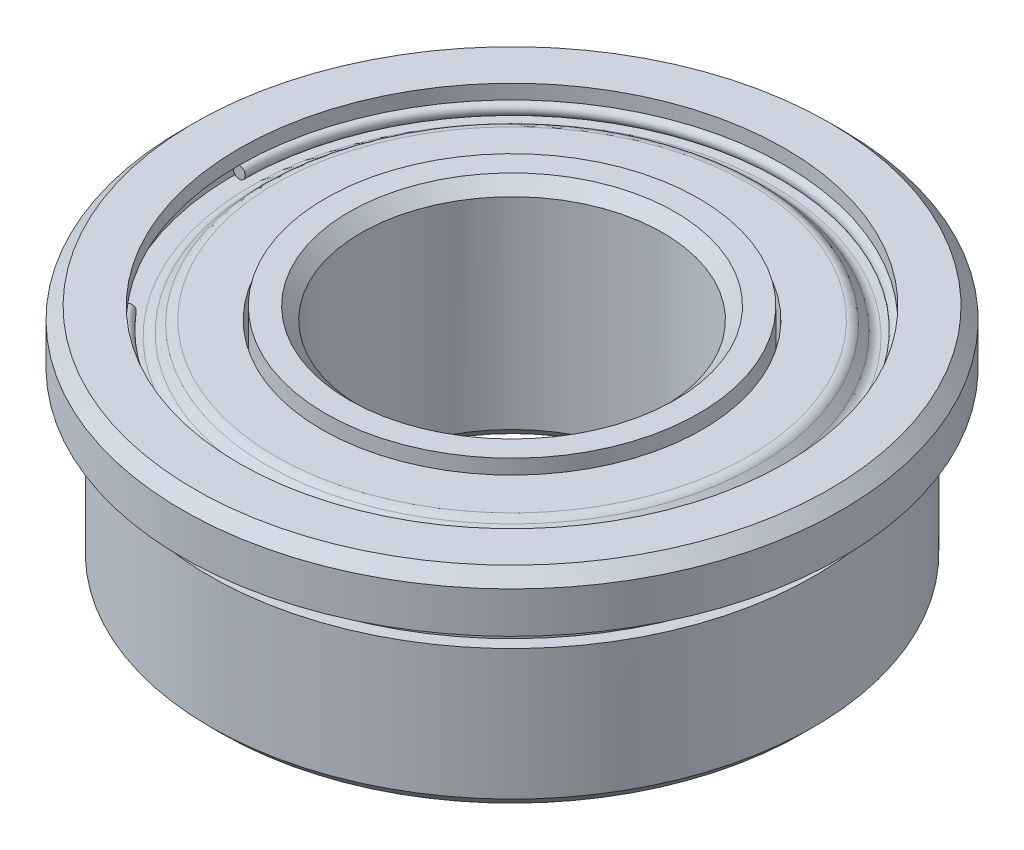
ISO-10303-21;
HEADER;
FILE_DESCRIPTION(('STEP AP214'),'2;1');
FILE_NAME('part.step','',(''),(''),'','','');
FILE_SCHEMA(('AUTOMOTIVE_DESIGN { 1 0 10303 214 1 1 1 1 }'));
ENDSEC;
DATA;
#1=APPLICATION_CONTEXT('core data for automotive mechanical design processes');
#2=APPLICATION_PROTOCOL_DEFINITION('international standard','automotive_design',2000,#1);
#3=PRODUCT_CONTEXT('',#1,'mechanical');
#4=PRODUCT('Part','Part','',(#3));
#5=PRODUCT_RELATED_PRODUCT_CATEGORY('part','',(#4));
#6=PRODUCT_DEFINITION_FORMATION('','',#4);
#7=PRODUCT_DEFINITION_CONTEXT('part definition',#1,'design');
#8=PRODUCT_DEFINITION('design','',#6,#7);
#9=PRODUCT_DEFINITION_SHAPE('','',#8);
#10=(LENGTH_UNIT() NAMED_UNIT(*) SI_UNIT(.MILLI.,.METRE.));
#11=(NAMED_UNIT(*) PLANE_ANGLE_UNIT() SI_UNIT($,.RADIAN.));
#12=(NAMED_UNIT(*) SI_UNIT($,.STERADIAN.) SOLID_ANGLE_UNIT());
#13=UNCERTAINTY_MEASURE_WITH_UNIT(LENGTH_MEASURE(1.E-05),#10,'distance_accuracy_value','');
#14=(GEOMETRIC_REPRESENTATION_CONTEXT(3) GLOBAL_UNCERTAINTY_ASSIGNED_CONTEXT((#13)) GLOBAL_UNIT_ASSIGNED_CONTEXT((#10,
#11,#12)) REPRESENTATION_CONTEXT('',''));
#15=CARTESIAN_POINT('',(0.,0.,0.));
#16=DIRECTION('',(0.,0.,1.));
#17=DIRECTION('',(1.,0.,0.));
#18=AXIS2_PLACEMENT_3D('',#15,#16,#17);
#19=CARTESIAN_POINT('',(-5.7404,0.431800000000002,0.));
#20=DIRECTION('',(0.,0.,1.));
#21=DIRECTION('',(1.,0.,0.));
#22=AXIS2_PLACEMENT_3D('',#19,#20,#21);
#23=PLANE('',#22);
#24=CARTESIAN_POINT('',(-5.6134,0.431800000000002,0.));
#25=CARTESIAN_POINT('',(-5.61340899992696,0.417569642926092,0.));
#26=CARTESIAN_POINT('',(-5.61583449231307,0.403251719708381,0.));
#27=CARTESIAN_POINT('',(-5.62528379429475,0.376272860189244,0.));
#28=CARTESIAN_POINT('',(-5.63230760389031,0.363611923887818,0.));
#29=CARTESIAN_POINT('',(-5.65015126434134,0.341316101747298,0.));
#30=CARTESIAN_POINT('',(-5.66097111519689,0.331681215908281,0.));
#31=CARTESIAN_POINT('',(-5.68518979269764,0.316539316925007,0.));
#32=CARTESIAN_POINT('',(-5.69858861934284,0.311032303780751,0.));
#33=CARTESIAN_POINT('',(-5.72645386450994,0.304763137356642,0.));
#34=CARTESIAN_POINT('',(-5.74092028303185,0.304000984076788,0.));
#35=CARTESIAN_POINT('',(-5.76929001376165,0.307307449590691,0.));
#36=CARTESIAN_POINT('',(-5.78319332596954,0.311376068384447,0.));
#37=CARTESIAN_POINT('',(-5.80886899590066,0.323889318093972,0.));
#38=CARTESIAN_POINT('',(-5.8206413536239,0.332333949009741,0.));
#39=CARTESIAN_POINT('',(-5.84072901054135,0.35263138586272,0.));
#40=CARTESIAN_POINT('',(-5.84904430973557,0.36448419179993,0.));
#41=CARTESIAN_POINT('',(-5.86127615792845,0.390320794880103,0.));
#42=CARTESIAN_POINT('',(-5.8651927069271,0.404304592023067,0.));
#43=CARTESIAN_POINT('',(-5.86716833023764,0.422889694465366,0.));
#44=CARTESIAN_POINT('',(-5.86740282036117,0.427340547537076,0.));
#45=CARTESIAN_POINT('',(-5.86739100007304,0.446030357073912,0.));
#46=CARTESIAN_POINT('',(-5.86496550768693,0.460348280291623,0.));
#47=CARTESIAN_POINT('',(-5.85551620570525,0.48732713981076,0.));
#48=CARTESIAN_POINT('',(-5.84849239610969,0.499988076112186,0.));
#49=CARTESIAN_POINT('',(-5.83064873565866,0.522283898252706,0.));
#50=CARTESIAN_POINT('',(-5.8198288848031,0.531918784091723,0.));
#51=CARTESIAN_POINT('',(-5.79561020730236,0.547060683074997,0.));
#52=CARTESIAN_POINT('',(-5.78221138065716,0.552567696219253,0.));
#53=CARTESIAN_POINT('',(-5.75434613549006,0.558836862643363,0.));
#54=CARTESIAN_POINT('',(-5.73987971696815,0.559599015923216,0.));
#55=CARTESIAN_POINT('',(-5.71150998623835,0.556292550409314,0.));
#56=CARTESIAN_POINT('',(-5.69760667403046,0.552223931615557,0.));
#57=CARTESIAN_POINT('',(-5.67193100409933,0.539710681906032,0.));
#58=CARTESIAN_POINT('',(-5.6601586463761,0.531266050990263,0.));
#59=CARTESIAN_POINT('',(-5.64007098945865,0.510968614137284,0.));
#60=CARTESIAN_POINT('',(-5.63175569026443,0.499115808200075,0.));
#61=CARTESIAN_POINT('',(-5.61952384207155,0.473279205119902,0.));
#62=CARTESIAN_POINT('',(-5.61560729307289,0.459295407976938,0.));
#63=CARTESIAN_POINT('',(-5.61363166976236,0.440710305534639,0.));
#64=CARTESIAN_POINT('',(-5.61339717963883,0.436259452462929,0.));
#65=CARTESIAN_POINT('',(-5.6134,0.431800000000002,0.));
#66=B_SPLINE_CURVE_WITH_KNOTS('',3,(#24,#25,#26,#27,#28,#29,#30,#31,#32,#33,#34,#35,#36,#37,#38,
#39,#40,#41,#42,#43,#44,#45,#46,#47,#48,#49,#50,#51,#52,#53,#54,#55,#56,#57,#58,#59,#60,#61,#62,
#63,#64,#65),.UNSPECIFIED.,.T.,.F.,(4,2,2,2,2,2,2,2,2,2,2,2,2,2,2,2,2,2,2,2,4),(0.,
0.0426429642402332,0.0852859284804665,0.127928892721776,0.170571856963085,0.213214821204395,
0.255857785445704,0.298500749687013,0.341143713928322,0.383786678169631,0.397149959984692,
0.439792924224925,0.482435888465158,0.525078852706467,0.567721816947776,0.610364781189087,
0.653007745430395,0.695650709671705,0.738293673913014,0.780936638154323,0.794299919969383),.UNSPECIFIED.);
#67=CARTESIAN_POINT('',(-5.6134,0.431800000000002,0.));
#68=VERTEX_POINT('',#67);
#69=EDGE_CURVE('P0_E21',#68,#68,#66,.T.);
#70=ORIENTED_EDGE('',*,*,#69,.F.);
#71=EDGE_LOOP('',(#70));
#72=FACE_BOUND('',#71,.T.);
#73=ADVANCED_FACE('P0_F17',(#72),#23,.T.);
#74=CARTESIAN_POINT('',(-4.39740152128023,0.431800000000002,3.68985799464456));
#75=DIRECTION('',(0.64278760968653,0.,0.766044443118986));
#76=DIRECTION('',(0.766044443118986,0.,-0.64278760968653));
#77=AXIS2_PLACEMENT_3D('',#74,#75,#76);
#78=PLANE('',#77);
#79=CARTESIAN_POINT('',(-4.49468916555634,0.431800000000002,3.77149202107475));
#80=CARTESIAN_POINT('',(-4.4946822712123,0.417569642926092,3.77148623603321));
#81=CARTESIAN_POINT('',(-4.49282423624809,0.403251719708381,3.76992715958003));
#82=CARTESIAN_POINT('',(-4.48558565097368,0.376272860189244,3.76385326534602));
#83=CARTESIAN_POINT('',(-4.48020510066347,0.363611923887818,3.75933844756519));
#84=CARTESIAN_POINT('',(-4.46653606373006,0.341316101747298,3.74786876371582));
#85=CARTESIAN_POINT('',(-4.45824757710678,0.331681215908281,3.74091389764721));
#86=CARTESIAN_POINT('',(-4.43969499378764,0.316539316925007,3.72534643182674));
#87=CARTESIAN_POINT('',(-4.42943089709178,0.311032303780751,3.71673383207487));
#88=CARTESIAN_POINT('',(-4.40808488087537,0.304763137356642,3.69882239774058));
#89=CARTESIAN_POINT('',(-4.39700296135483,0.304000984076788,3.68952356315815));
#90=CARTESIAN_POINT('',(-4.37527048677648,0.307307449590691,3.67128785175489));
#91=CARTESIAN_POINT('',(-4.36461993171868,0.311376068384447,3.66235097493406));
#92=CARTESIAN_POINT('',(-4.34495122744459,0.323889318093972,3.64584697243193));
#93=CARTESIAN_POINT('',(-4.33593307822829,0.332333949009741,3.63827984675064));
#94=CARTESIAN_POINT('',(-4.3205450402714,0.35263138586272,3.62536774977647));
#95=CARTESIAN_POINT('',(-4.3141751515308,0.36448419179993,3.62002277848359));
#96=CARTESIAN_POINT('',(-4.30480501219357,0.390320794880103,3.61216029802164));
#97=CARTESIAN_POINT('',(-4.30180476159694,0.404304592023067,3.60964278885257));
#98=CARTESIAN_POINT('',(-4.30029134633821,0.422889694465366,3.60837288266715));
#99=CARTESIAN_POINT('',(-4.30011171648212,0.427340547537076,3.60822215532116));
#100=CARTESIAN_POINT('',(-4.30012077134815,0.446030357073912,3.6082297532559));
#101=CARTESIAN_POINT('',(-4.30197880631236,0.460348280291623,3.60978882970909));
#102=CARTESIAN_POINT('',(-4.30921739158678,0.48732713981076,3.6158627239431));
#103=CARTESIAN_POINT('',(-4.31459794189698,0.499988076112186,3.62037754172392));
#104=CARTESIAN_POINT('',(-4.32826697883039,0.522283898252706,3.63184722557329));
#105=CARTESIAN_POINT('',(-4.33655546545367,0.531918784091724,3.6388020916419));
#106=CARTESIAN_POINT('',(-4.35510804877281,0.547060683074997,3.65436955746238));
#107=CARTESIAN_POINT('',(-4.36537214546867,0.552567696219253,3.66298215721424));
#108=CARTESIAN_POINT('',(-4.38671816168508,0.558836862643363,3.68089359154854));
#109=CARTESIAN_POINT('',(-4.39780008120563,0.559599015923216,3.69019242613096));
#110=CARTESIAN_POINT('',(-4.41953255578397,0.556292550409314,3.70842813753422));
#111=CARTESIAN_POINT('',(-4.43018311084177,0.552223931615558,3.71736501435505));
#112=CARTESIAN_POINT('',(-4.44985181511587,0.539710681906033,3.73386901685718));
#113=CARTESIAN_POINT('',(-4.45886996433216,0.531266050990263,3.74143614253848));
#114=CARTESIAN_POINT('',(-4.47425800228906,0.510968614137284,3.75434823951265));
#115=CARTESIAN_POINT('',(-4.48062789102966,0.499115808200075,3.75969321080553));
#116=CARTESIAN_POINT('',(-4.48999803036688,0.473279205119902,3.76755569126747));
#117=CARTESIAN_POINT('',(-4.49299828096351,0.459295407976938,3.77007320043654));
#118=CARTESIAN_POINT('',(-4.49451169622224,0.440710305534638,3.77134310662196));
#119=CARTESIAN_POINT('',(-4.49469132607834,0.436259452462929,3.77149383396796));
#120=CARTESIAN_POINT('',(-4.49468916555634,0.431800000000002,3.77149202107475));
#121=B_SPLINE_CURVE_WITH_KNOTS('',3,(#79,#80,#81,#82,#83,#84,#85,#86,#87,#88,#89,#90,#91,#92,
#93,#94,#95,#96,#97,#98,#99,#100,#101,#102,#103,#104,#105,#106,#107,#108,#109,#110,#111,#112,
#113,#114,#115,#116,#117,#118,#119,#120),.UNSPECIFIED.,.T.,.F.,(4,2,2,2,2,2,2,2,2,2,2,2,2,2,2,2,
2,2,2,2,4),(0.,0.0426429642402332,0.0852859284804667,0.127928892721776,0.170571856963085,
0.213214821204394,0.255857785445703,0.298500749687013,0.341143713928323,0.383786678169632,
0.397149959984692,0.439792924224925,0.482435888465158,0.525078852706467,0.567721816947777,
0.610364781189086,0.653007745430395,0.695650709671705,0.738293673913014,0.780936638154323,
0.794299919969383),.UNSPECIFIED.);
#122=CARTESIAN_POINT('',(-4.49468916555634,0.431800000000002,3.77149202107475));
#123=VERTEX_POINT('',#122);
#124=EDGE_CURVE('P0_E11',#123,#123,#121,.T.);
#125=ORIENTED_EDGE('',*,*,#124,.F.);
#126=EDGE_LOOP('',(#125));
#127=FACE_BOUND('',#126,.T.);
#128=ADVANCED_FACE('P0_F42',(#127),#78,.F.);
#129=CARTESIAN_POINT('',(0.,0.431800000000002,0.));
#130=DIRECTION('',(0.,-1.,0.));
#131=DIRECTION('',(0.,0.,1.));
#132=AXIS2_PLACEMENT_3D('',#129,#130,#131);
#133=TOROIDAL_SURFACE('',#132,5.7404,0.127000000000001);
#134=ORIENTED_EDGE('',*,*,#124,.T.);
#135=EDGE_LOOP('',(#134));
#136=FACE_BOUND('',#135,.T.);
#137=ORIENTED_EDGE('',*,*,#69,.T.);
#138=EDGE_LOOP('',(#137));
#139=FACE_BOUND('',#138,.T.);
#140=ADVANCED_FACE('P0_F44',(#136,#139),#133,.T.);
#141=CLOSED_SHELL('',(#73,#128,#140));
#142=MANIFOLD_SOLID_BREP('P0_B1',#141);
#143=CARTESIAN_POINT('',(-4.39740152128023,4.318,3.68985799464456));
#144=DIRECTION('',(0.64278760968653,0.,0.766044443118986));
#145=DIRECTION('',(0.766044443118986,0.,-0.64278760968653));
#146=AXIS2_PLACEMENT_3D('',#143,#144,#145);
#147=PLANE('',#146);
#148=CARTESIAN_POINT('',(-4.30011387700412,4.318,3.60822396821436));
#149=CARTESIAN_POINT('',(-4.30012077134816,4.33223035707391,3.60822975325589));
#150=CARTESIAN_POINT('',(-4.30197880631237,4.34654828029162,3.60978882970908));
#151=CARTESIAN_POINT('',(-4.30921739158678,4.37352713981076,3.6158627239431));
#152=CARTESIAN_POINT('',(-4.31459794189698,4.38618807611218,3.62037754172392));
#153=CARTESIAN_POINT('',(-4.32826697883039,4.4084838982527,3.6318472255733));
#154=CARTESIAN_POINT('',(-4.33655546545367,4.41811878409172,3.6388020916419));
#155=CARTESIAN_POINT('',(-4.35510804877281,4.43326068307499,3.65436955746237));
#156=CARTESIAN_POINT('',(-4.36537214546868,4.43876769621925,3.66298215721424));
#157=CARTESIAN_POINT('',(-4.38671816168508,4.44503686264336,3.68089359154854));
#158=CARTESIAN_POINT('',(-4.39780008120562,4.44579901592321,3.69019242613097));
#159=CARTESIAN_POINT('',(-4.41953255578397,4.44249255040931,3.70842813753422));
#160=CARTESIAN_POINT('',(-4.43018311084177,4.43842393161555,3.71736501435505));
#161=CARTESIAN_POINT('',(-4.44985181511587,4.42591068190603,3.73386901685718));
#162=CARTESIAN_POINT('',(-4.45886996433217,4.41746605099026,3.74143614253847));
#163=CARTESIAN_POINT('',(-4.47425800228906,4.39716861413728,3.75434823951265));
#164=CARTESIAN_POINT('',(-4.48062789102965,4.38531580820007,3.75969321080553));
#165=CARTESIAN_POINT('',(-4.48999803036688,4.3594792051199,3.76755569126748));
#166=CARTESIAN_POINT('',(-4.49299828096351,4.34549540797693,3.77007320043655));
#167=CARTESIAN_POINT('',(-4.49451169622224,4.32691030553463,3.77134310662196));
#168=CARTESIAN_POINT('',(-4.49469132607833,4.32245945246292,3.77149383396796));
#169=CARTESIAN_POINT('',(-4.4946822712123,4.30376964292609,3.77148623603321));
#170=CARTESIAN_POINT('',(-4.49282423624809,4.28945171970838,3.76992715958002));
#171=CARTESIAN_POINT('',(-4.48558565097368,4.26247286018924,3.76385326534601));
#172=CARTESIAN_POINT('',(-4.48020510066347,4.24981192388781,3.75933844756519));
#173=CARTESIAN_POINT('',(-4.46653606373006,4.22751610174729,3.74786876371582));
#174=CARTESIAN_POINT('',(-4.45824757710679,4.21788121590828,3.74091389764721));
#175=CARTESIAN_POINT('',(-4.43969499378765,4.202739316925,3.72534643182673));
#176=CARTESIAN_POINT('',(-4.42943089709178,4.19723230378075,3.71673383207487));
#177=CARTESIAN_POINT('',(-4.40808488087537,4.19096313735664,3.69882239774058));
#178=CARTESIAN_POINT('',(-4.39700296135482,4.19020098407678,3.68952356315816));
#179=CARTESIAN_POINT('',(-4.37527048677648,4.19350744959069,3.6712878517549));
#180=CARTESIAN_POINT('',(-4.36461993171868,4.19757606838444,3.66235097493406));
#181=CARTESIAN_POINT('',(-4.34495122744458,4.21008931809397,3.64584697243194));
#182=CARTESIAN_POINT('',(-4.33593307822829,4.21853394900974,3.63827984675064));
#183=CARTESIAN_POINT('',(-4.3205450402714,4.23883138586272,3.62536774977647));
#184=CARTESIAN_POINT('',(-4.3141751515308,4.25068419179993,3.62002277848358));
#185=CARTESIAN_POINT('',(-4.30480501219357,4.2765207948801,3.61216029802164));
#186=CARTESIAN_POINT('',(-4.30180476159693,4.29050459202306,3.60964278885258));
#187=CARTESIAN_POINT('',(-4.30029134633821,4.30908969446536,3.60837288266715));
#188=CARTESIAN_POINT('',(-4.30011171648212,4.31354054753707,3.60822215532115));
#189=CARTESIAN_POINT('',(-4.30011387700412,4.318,3.60822396821436));
#190=B_SPLINE_CURVE_WITH_KNOTS('',3,(#148,#149,#150,#151,#152,#153,#154,#155,#156,#157,#158,
#159,#160,#161,#162,#163,#164,#165,#166,#167,#168,#169,#170,#171,#172,#173,#174,#175,#176,#177,
#178,#179,#180,#181,#182,#183,#184,#185,#186,#187,#188,#189),.UNSPECIFIED.,.T.,.F.,(4,2,2,2,2,2,
2,2,2,2,2,2,2,2,2,2,2,2,2,2,4),(0.,0.0426429642402329,0.0852859284804657,0.127928892721776,
0.170571856963086,0.213214821204394,0.255857785445703,0.298500749687014,0.341143713928323,
0.383786678169631,0.397149959984691,0.439792924224924,0.482435888465157,0.525078852706467,
0.567721816947777,0.610364781189087,0.653007745430396,0.695650709671705,0.738293673913014,
0.780936638154323,0.794299919969383),.UNSPECIFIED.);
#191=CARTESIAN_POINT('',(-4.30011387700412,4.318,3.60822396821436));
#192=VERTEX_POINT('',#191);
#193=EDGE_CURVE('P1_E21',#192,#192,#190,.T.);
#194=ORIENTED_EDGE('',*,*,#193,.F.);
#195=EDGE_LOOP('',(#194));
#196=FACE_BOUND('',#195,.T.);
#197=ADVANCED_FACE('P1_F17',(#196),#147,.F.);
#198=CARTESIAN_POINT('',(-5.7404,4.318,0.));
#199=DIRECTION('',(0.,0.,1.));
#200=DIRECTION('',(1.,0.,0.));
#201=AXIS2_PLACEMENT_3D('',#198,#199,#200);
#202=PLANE('',#201);
#203=CARTESIAN_POINT('',(-5.8674,4.318,0.));
#204=CARTESIAN_POINT('',(-5.86739100007304,4.33223035707391,0.));
#205=CARTESIAN_POINT('',(-5.86496550768693,4.34654828029162,0.));
#206=CARTESIAN_POINT('',(-5.85551620570525,4.37352713981076,0.));
#207=CARTESIAN_POINT('',(-5.84849239610969,4.38618807611218,0.));
#208=CARTESIAN_POINT('',(-5.83064873565866,4.4084838982527,0.));
#209=CARTESIAN_POINT('',(-5.8198288848031,4.41811878409172,0.));
#210=CARTESIAN_POINT('',(-5.79561020730235,4.43326068307499,0.));
#211=CARTESIAN_POINT('',(-5.78221138065716,4.43876769621925,0.));
#212=CARTESIAN_POINT('',(-5.75434613549006,4.44503686264336,0.));
#213=CARTESIAN_POINT('',(-5.73987971696815,4.44579901592321,0.));
#214=CARTESIAN_POINT('',(-5.71150998623835,4.44249255040931,0.));
#215=CARTESIAN_POINT('',(-5.69760667403046,4.43842393161555,0.));
#216=CARTESIAN_POINT('',(-5.67193100409933,4.42591068190603,0.));
#217=CARTESIAN_POINT('',(-5.6601586463761,4.41746605099026,0.));
#218=CARTESIAN_POINT('',(-5.64007098945865,4.39716861413728,0.));
#219=CARTESIAN_POINT('',(-5.63175569026443,4.38531580820007,0.));
#220=CARTESIAN_POINT('',(-5.61952384207155,4.3594792051199,0.));
#221=CARTESIAN_POINT('',(-5.61560729307289,4.34549540797693,0.));
#222=CARTESIAN_POINT('',(-5.61363166976236,4.32691030553463,0.));
#223=CARTESIAN_POINT('',(-5.61339717963883,4.32245945246292,0.));
#224=CARTESIAN_POINT('',(-5.61340899992696,4.30376964292609,0.));
#225=CARTESIAN_POINT('',(-5.61583449231307,4.28945171970838,0.));
#226=CARTESIAN_POINT('',(-5.62528379429475,4.26247286018924,0.));
#227=CARTESIAN_POINT('',(-5.63230760389031,4.24981192388781,0.));
#228=CARTESIAN_POINT('',(-5.65015126434134,4.22751610174729,0.));
#229=CARTESIAN_POINT('',(-5.6609711151969,4.21788121590828,0.));
#230=CARTESIAN_POINT('',(-5.68518979269764,4.202739316925,0.));
#231=CARTESIAN_POINT('',(-5.69858861934284,4.19723230378075,0.));
#232=CARTESIAN_POINT('',(-5.72645386450994,4.19096313735664,0.));
#233=CARTESIAN_POINT('',(-5.74092028303185,4.19020098407678,0.));
#234=CARTESIAN_POINT('',(-5.76929001376165,4.19350744959069,0.));
#235=CARTESIAN_POINT('',(-5.78319332596954,4.19757606838444,0.));
#236=CARTESIAN_POINT('',(-5.80886899590066,4.21008931809397,0.));
#237=CARTESIAN_POINT('',(-5.8206413536239,4.21853394900974,0.));
#238=CARTESIAN_POINT('',(-5.84072901054135,4.23883138586272,0.));
#239=CARTESIAN_POINT('',(-5.84904430973557,4.25068419179993,0.));
#240=CARTESIAN_POINT('',(-5.86127615792845,4.2765207948801,0.));
#241=CARTESIAN_POINT('',(-5.8651927069271,4.29050459202306,0.));
#242=CARTESIAN_POINT('',(-5.86716833023764,4.30908969446536,0.));
#243=CARTESIAN_POINT('',(-5.86740282036117,4.31354054753707,0.));
#244=CARTESIAN_POINT('',(-5.8674,4.318,0.));
#245=B_SPLINE_CURVE_WITH_KNOTS('',3,(#203,#204,#205,#206,#207,#208,#209,#210,#211,#212,#213,
#214,#215,#216,#217,#218,#219,#220,#221,#222,#223,#224,#225,#226,#227,#228,#229,#230,#231,#232,
#233,#234,#235,#236,#237,#238,#239,#240,#241,#242,#243,#244),.UNSPECIFIED.,.T.,.F.,(4,2,2,2,2,2,
2,2,2,2,2,2,2,2,2,2,2,2,2,2,4),(0.,0.0426429642402329,0.0852859284804661,0.127928892721776,
0.170571856963085,0.213214821204394,0.255857785445704,0.298500749687014,0.341143713928322,
0.383786678169632,0.397149959984692,0.439792924224924,0.482435888465158,0.525078852706468,
0.567721816947777,0.610364781189085,0.653007745430395,0.695650709671705,0.738293673913015,
0.780936638154323,0.794299919969383),.UNSPECIFIED.);
#246=CARTESIAN_POINT('',(-5.8674,4.318,0.));
#247=VERTEX_POINT('',#246);
#248=EDGE_CURVE('P1_E11',#247,#247,#245,.T.);
#249=ORIENTED_EDGE('',*,*,#248,.F.);
#250=EDGE_LOOP('',(#249));
#251=FACE_BOUND('',#250,.T.);
#252=ADVANCED_FACE('P1_F44',(#251),#202,.T.);
#253=CARTESIAN_POINT('',(0.,4.318,0.));
#254=DIRECTION('',(0.,1.,0.));
#255=DIRECTION('',(0.,0.,1.));
#256=AXIS2_PLACEMENT_3D('',#253,#254,#255);
#257=TOROIDAL_SURFACE('',#256,5.7404,0.127000000000001);
#258=ORIENTED_EDGE('',*,*,#248,.T.);
#259=EDGE_LOOP('',(#258));
#260=FACE_BOUND('',#259,.T.);
#261=ORIENTED_EDGE('',*,*,#193,.T.);
#262=EDGE_LOOP('',(#261));
#263=FACE_BOUND('',#262,.T.);
#264=ADVANCED_FACE('P1_F42',(#260,#263),#257,.T.);
#265=CLOSED_SHELL('',(#197,#252,#264));
#266=MANIFOLD_SOLID_BREP('P1_B1',#265);
#267=CARTESIAN_POINT('',(0.,4.7498,0.));
#268=DIRECTION('',(0.,1.,0.));
#269=DIRECTION('',(0.,0.,1.));
#270=AXIS2_PLACEMENT_3D('',#267,#268,#269);
#271=PLANE('',#270);
#272=CARTESIAN_POINT('',(0.,4.7498,0.));
#273=DIRECTION('',(0.,1.,0.));
#274=DIRECTION('',(0.,0.,1.));
#275=AXIS2_PLACEMENT_3D('',#272,#273,#274);
#276=CIRCLE('',#275,3.9243);
#277=CARTESIAN_POINT('',(0.,4.7498,3.9243));
#278=VERTEX_POINT('',#277);
#279=EDGE_CURVE('P2_E311',#278,#278,#276,.F.);
#280=ORIENTED_EDGE('',*,*,#279,.F.);
#281=EDGE_LOOP('',(#280));
#282=FACE_BOUND('',#281,.T.);
#283=CARTESIAN_POINT('',(0.,4.74979999995639,0.));
#284=DIRECTION('',(0.,1.,0.));
#285=DIRECTION('',(0.,0.,1.));
#286=AXIS2_PLACEMENT_3D('',#283,#284,#285);
#287=CIRCLE('',#286,3.42899999998281);
#288=CARTESIAN_POINT('',(0.,4.74979999995639,3.42899999998281));
#289=VERTEX_POINT('',#288);
#290=EDGE_CURVE('P2_E309',#289,#289,#287,.F.);
#291=ORIENTED_EDGE('',*,*,#290,.T.);
#292=EDGE_LOOP('',(#291));
#293=FACE_BOUND('',#292,.T.);
#294=ADVANCED_FACE('P2_F19',(#282,#293),#271,.T.);
#295=CARTESIAN_POINT('',(0.,4.4958,0.));
#296=DIRECTION('',(0.,1.,0.));
#297=DIRECTION('',(0.,0.,1.));
#298=AXIS2_PLACEMENT_3D('',#295,#296,#297);
#299=CYLINDRICAL_SURFACE('',#298,3.9243);
#300=CARTESIAN_POINT('',(0.,3.2258,0.));
#301=DIRECTION('',(0.,1.,0.));
#302=DIRECTION('',(0.,0.,1.));
#303=AXIS2_PLACEMENT_3D('',#300,#301,#302);
#304=CIRCLE('',#303,3.9243);
#305=CARTESIAN_POINT('',(0.,3.2258,3.9243));
#306=VERTEX_POINT('',#305);
#307=EDGE_CURVE('P2_E306',#306,#306,#304,.F.);
#308=ORIENTED_EDGE('',*,*,#307,.F.);
#309=EDGE_LOOP('',(#308));
#310=FACE_BOUND('',#309,.T.);
#311=ORIENTED_EDGE('',*,*,#279,.T.);
#312=EDGE_LOOP('',(#311));
#313=FACE_BOUND('',#312,.T.);
#314=ADVANCED_FACE('P2_F133',(#310,#313),#299,.T.);
#315=CARTESIAN_POINT('',(0.,4.74979999984271,0.));
#316=DIRECTION('',(0.,1.,0.));
#317=DIRECTION('',(0.,0.,1.));
#318=AXIS2_PLACEMENT_3D('',#315,#316,#317);
#319=CONICAL_SURFACE('',#318,3.42899999986912,0.785398163397448);
#320=ORIENTED_EDGE('',*,*,#290,.F.);
#321=EDGE_LOOP('',(#320));
#322=FACE_BOUND('',#321,.T.);
#323=CARTESIAN_POINT('',(0.,4.4958,0.));
#324=DIRECTION('',(0.,1.,0.));
#325=DIRECTION('',(0.,0.,1.));
#326=AXIS2_PLACEMENT_3D('',#323,#324,#325);
#327=CIRCLE('',#326,3.175);
#328=CARTESIAN_POINT('',(0.,4.4958,3.175));
#329=VERTEX_POINT('',#328);
#330=EDGE_CURVE('P2_E303',#329,#329,#327,.F.);
#331=ORIENTED_EDGE('',*,*,#330,.T.);
#332=EDGE_LOOP('',(#331));
#333=FACE_BOUND('',#332,.T.);
#334=ADVANCED_FACE('P2_F130',(#322,#333),#319,.F.);
#335=CARTESIAN_POINT('',(0.,3.2258,0.));
#336=DIRECTION('',(0.,1.,0.));
#337=DIRECTION('',(0.,0.,1.));
#338=AXIS2_PLACEMENT_3D('',#335,#336,#337);
#339=PLANE('',#338);
#340=CARTESIAN_POINT('',(0.,3.2258,0.));
#341=DIRECTION('',(0.,1.,0.));
#342=DIRECTION('',(0.,0.,1.));
#343=AXIS2_PLACEMENT_3D('',#340,#341,#342);
#344=CIRCLE('',#343,4.0005);
#345=CARTESIAN_POINT('',(0.,3.2258,4.0005));
#346=VERTEX_POINT('',#345);
#347=EDGE_CURVE('P2_E298',#346,#346,#344,.T.);
#348=ORIENTED_EDGE('',*,*,#347,.T.);
#349=EDGE_LOOP('',(#348));
#350=FACE_BOUND('',#349,.T.);
#351=ORIENTED_EDGE('',*,*,#307,.T.);
#352=EDGE_LOOP('',(#351));
#353=FACE_BOUND('',#352,.T.);
#354=ADVANCED_FACE('P2_F126',(#350,#353),#339,.T.);
#355=CARTESIAN_POINT('',(0.,0.,0.));
#356=DIRECTION('',(0.,1.,0.));
#357=DIRECTION('',(0.,0.,1.));
#358=AXIS2_PLACEMENT_3D('',#355,#356,#357);
#359=CYLINDRICAL_SURFACE('',#358,3.175);
#360=ORIENTED_EDGE('',*,*,#330,.F.);
#361=EDGE_LOOP('',(#360));
#362=FACE_BOUND('',#361,.T.);
#363=CARTESIAN_POINT('',(0.,0.254000000040833,0.));
#364=DIRECTION('',(0.,-1.,0.));
#365=DIRECTION('',(0.,0.,-1.));
#366=AXIS2_PLACEMENT_3D('',#363,#364,#365);
#367=CIRCLE('',#366,3.17499999999882);
#368=CARTESIAN_POINT('',(0.,0.254000000040833,-3.17499999999882));
#369=VERTEX_POINT('',#368);
#370=EDGE_CURVE('P2_E80',#369,#369,#367,.T.);
#371=ORIENTED_EDGE('',*,*,#370,.T.);
#372=EDGE_LOOP('',(#371));
#373=FACE_BOUND('',#372,.T.);
#374=ADVANCED_FACE('P2_F122',(#362,#373),#359,.F.);
#375=CARTESIAN_POINT('',(0.,3.2258,0.));
#376=DIRECTION('',(0.,1.,0.));
#377=DIRECTION('',(0.,0.,1.));
#378=AXIS2_PLACEMENT_3D('',#375,#376,#377);
#379=CYLINDRICAL_SURFACE('',#378,4.0005);
#380=CARTESIAN_POINT('',(0.,4.4958,0.));
#381=DIRECTION('',(0.,1.,0.));
#382=DIRECTION('',(0.,0.,1.));
#383=AXIS2_PLACEMENT_3D('',#380,#381,#382);
#384=CIRCLE('',#383,4.0005);
#385=CARTESIAN_POINT('',(0.,4.4958,4.0005));
#386=VERTEX_POINT('',#385);
#387=EDGE_CURVE('P2_E304',#386,#386,#384,.F.);
#388=ORIENTED_EDGE('',*,*,#387,.F.);
#389=EDGE_LOOP('',(#388));
#390=FACE_BOUND('',#389,.T.);
#391=ORIENTED_EDGE('',*,*,#347,.F.);
#392=EDGE_LOOP('',(#391));
#393=FACE_BOUND('',#392,.T.);
#394=ADVANCED_FACE('P2_F118',(#390,#393),#379,.F.);
#395=CARTESIAN_POINT('',(0.,5.6843418860808E-11,0.));
#396=DIRECTION('',(0.,-1.,0.));
#397=DIRECTION('',(0.,0.,-1.));
#398=AXIS2_PLACEMENT_3D('',#395,#396,#397);
#399=CONICAL_SURFACE('',#398,3.42899999998281,0.785398163285552);
#400=CARTESIAN_POINT('',(0.,0.,0.));
#401=DIRECTION('',(0.,-1.,0.));
#402=DIRECTION('',(0.,0.,-1.));
#403=AXIS2_PLACEMENT_3D('',#400,#401,#402);
#404=CIRCLE('',#403,3.42900000003965);
#405=CARTESIAN_POINT('',(0.,0.,-3.42900000003965));
#406=VERTEX_POINT('',#405);
#407=EDGE_CURVE('P2_E66',#406,#406,#404,.T.);
#408=ORIENTED_EDGE('',*,*,#407,.T.);
#409=EDGE_LOOP('',(#408));
#410=FACE_BOUND('',#409,.T.);
#411=ORIENTED_EDGE('',*,*,#370,.F.);
#412=EDGE_LOOP('',(#411));
#413=FACE_BOUND('',#412,.T.);
#414=ADVANCED_FACE('P2_F113',(#410,#413),#399,.F.);
#415=CARTESIAN_POINT('',(0.,4.4958,0.));
#416=DIRECTION('',(0.,1.,0.));
#417=DIRECTION('',(0.,0.,1.));
#418=AXIS2_PLACEMENT_3D('',#415,#416,#417);
#419=PLANE('',#418);
#420=ORIENTED_EDGE('',*,*,#387,.T.);
#421=EDGE_LOOP('',(#420));
#422=FACE_BOUND('',#421,.T.);
#423=CARTESIAN_POINT('',(0.,4.4958,0.));
#424=DIRECTION('',(0.,-1.,0.));
#425=DIRECTION('',(0.,0.,-1.));
#426=AXIS2_PLACEMENT_3D('',#423,#424,#425);
#427=CIRCLE('',#426,4.97478975515723);
#428=CARTESIAN_POINT('',(0.,4.4958,-4.97478975515723));
#429=VERTEX_POINT('',#428);
#430=CARTESIAN_POINT('',(0.,4.4958,4.97478975515723));
#431=VERTEX_POINT('',#430);
#432=EDGE_CURVE('P2_E64',#429,#431,#427,.T.);
#433=ORIENTED_EDGE('',*,*,#432,.F.);
#434=CARTESIAN_POINT('',(0.,4.4958,0.));
#435=DIRECTION('',(0.,-1.,0.));
#436=DIRECTION('',(0.,0.,1.));
#437=AXIS2_PLACEMENT_3D('',#434,#435,#436);
#438=CIRCLE('',#437,4.97478975515723);
#439=EDGE_CURVE('P2_E59',#431,#429,#438,.T.);
#440=ORIENTED_EDGE('',*,*,#439,.F.);
#441=EDGE_LOOP('',(#433,#440));
#442=FACE_BOUND('',#441,.T.);
#443=ADVANCED_FACE('P2_F63',(#422,#442),#419,.T.);
#444=CARTESIAN_POINT('',(0.,0.,0.));
#445=DIRECTION('',(0.,1.,0.));
#446=DIRECTION('',(0.,0.,1.));
#447=AXIS2_PLACEMENT_3D('',#444,#445,#446);
#448=PLANE('',#447);
#449=CARTESIAN_POINT('',(0.,0.,0.));
#450=DIRECTION('',(0.,-1.,0.));
#451=DIRECTION('',(0.,0.,-1.));
#452=AXIS2_PLACEMENT_3D('',#449,#450,#451);
#453=CIRCLE('',#452,3.9243);
#454=CARTESIAN_POINT('',(0.,0.,-3.9243));
#455=VERTEX_POINT('',#454);
#456=EDGE_CURVE('P2_E72',#455,#455,#453,.F.);
#457=ORIENTED_EDGE('',*,*,#456,.F.);
#458=EDGE_LOOP('',(#457));
#459=FACE_BOUND('',#458,.T.);
#460=ORIENTED_EDGE('',*,*,#407,.F.);
#461=EDGE_LOOP('',(#460));
#462=FACE_BOUND('',#461,.T.);
#463=ADVANCED_FACE('P2_F95',(#459,#462),#448,.F.);
#464=CARTESIAN_POINT('',(0.,4.2418,0.));
#465=DIRECTION('',(0.,1.,0.));
#466=DIRECTION('',(0.,0.,1.));
#467=AXIS2_PLACEMENT_3D('',#464,#465,#466);
#468=TOROIDAL_SURFACE('',#467,4.97478975515723,0.254);
#469=ORIENTED_EDGE('',*,*,#439,.T.);
#470=ORIENTED_EDGE('',*,*,#432,.T.);
#471=EDGE_LOOP('',(#469,#470));
#472=FACE_BOUND('',#471,.T.);
#473=CARTESIAN_POINT('',(0.,4.42140512245714,0.));
#474=DIRECTION('',(0.,-1.,0.));
#475=DIRECTION('',(0.,0.,-1.));
#476=AXIS2_PLACEMENT_3D('',#473,#474,#475);
#477=CIRCLE('',#476,5.15439487753611);
#478=CARTESIAN_POINT('',(0.,4.42140512245714,-5.15439487753611));
#479=VERTEX_POINT('',#478);
#480=EDGE_CURVE('P2_E100',#479,#479,#477,.T.);
#481=ORIENTED_EDGE('',*,*,#480,.F.);
#482=EDGE_LOOP('',(#481));
#483=FACE_BOUND('',#482,.T.);
#484=ADVANCED_FACE('P2_F70',(#472,#483),#468,.T.);
#485=CARTESIAN_POINT('',(0.,0.254,0.));
#486=DIRECTION('',(0.,-1.,0.));
#487=DIRECTION('',(0.,0.,-1.));
#488=AXIS2_PLACEMENT_3D('',#485,#486,#487);
#489=CYLINDRICAL_SURFACE('',#488,3.9243);
#490=ORIENTED_EDGE('',*,*,#456,.T.);
#491=EDGE_LOOP('',(#490));
#492=FACE_BOUND('',#491,.T.);
#493=CARTESIAN_POINT('',(0.,1.524,0.));
#494=DIRECTION('',(0.,-1.,0.));
#495=DIRECTION('',(0.,0.,-1.));
#496=AXIS2_PLACEMENT_3D('',#493,#494,#495);
#497=CIRCLE('',#496,3.9243);
#498=CARTESIAN_POINT('',(0.,1.524,-3.9243));
#499=VERTEX_POINT('',#498);
#500=EDGE_CURVE('P2_E363',#499,#499,#497,.F.);
#501=ORIENTED_EDGE('',*,*,#500,.F.);
#502=EDGE_LOOP('',(#501));
#503=FACE_BOUND('',#502,.T.);
#504=ADVANCED_FACE('P2_F94',(#492,#503),#489,.T.);
#505=CARTESIAN_POINT('',(0.,4.26539487756372,0.));
#506=DIRECTION('',(0.,-1.,0.));
#507=DIRECTION('',(0.,0.,-1.));
#508=AXIS2_PLACEMENT_3D('',#505,#506,#507);
#509=CONICAL_SURFACE('',#508,5.31040512237269,0.78539816321527);
#510=CARTESIAN_POINT('',(0.,4.26539487757862,0.));
#511=DIRECTION('',(0.,-1.,0.));
#512=DIRECTION('',(0.,0.,-1.));
#513=AXIS2_PLACEMENT_3D('',#510,#511,#512);
#514=CIRCLE('',#513,5.31040512242138);
#515=CARTESIAN_POINT('',(0.,4.26539487757862,-5.31040512242138));
#516=VERTEX_POINT('',#515);
#517=EDGE_CURVE('P2_E366',#516,#516,#514,.F.);
#518=ORIENTED_EDGE('',*,*,#517,.T.);
#519=EDGE_LOOP('',(#518));
#520=FACE_BOUND('',#519,.T.);
#521=ORIENTED_EDGE('',*,*,#480,.T.);
#522=EDGE_LOOP('',(#521));
#523=FACE_BOUND('',#522,.T.);
#524=ADVANCED_FACE('P2_F523',(#520,#523),#509,.T.);
#525=CARTESIAN_POINT('',(0.,1.524,0.));
#526=DIRECTION('',(0.,-1.,0.));
#527=DIRECTION('',(0.,0.,-1.));
#528=AXIS2_PLACEMENT_3D('',#525,#526,#527);
#529=PLANE('',#528);
#530=ORIENTED_EDGE('',*,*,#500,.T.);
#531=EDGE_LOOP('',(#530));
#532=FACE_BOUND('',#531,.T.);
#533=CARTESIAN_POINT('',(0.,1.524,0.));
#534=DIRECTION('',(0.,-1.,0.));
#535=DIRECTION('',(0.,0.,-1.));
#536=AXIS2_PLACEMENT_3D('',#533,#534,#535);
#537=CIRCLE('',#536,4.0005);
#538=CARTESIAN_POINT('',(0.,1.524,-4.0005));
#539=VERTEX_POINT('',#538);
#540=EDGE_CURVE('P2_E367',#539,#539,#537,.T.);
#541=ORIENTED_EDGE('',*,*,#540,.T.);
#542=EDGE_LOOP('',(#541));
#543=FACE_BOUND('',#542,.T.);
#544=ADVANCED_FACE('P2_F442',(#532,#543),#529,.T.);
#545=CARTESIAN_POINT('',(0.,4.445,0.));
#546=DIRECTION('',(0.,-1.,0.));
#547=DIRECTION('',(0.,0.,-1.));
#548=AXIS2_PLACEMENT_3D('',#545,#546,#547);
#549=TOROIDAL_SURFACE('',#548,5.49001024484277,0.254);
#550=CARTESIAN_POINT('',(0.,4.191,0.));
#551=DIRECTION('',(0.,1.,0.));
#552=DIRECTION('',(0.,0.,1.));
#553=AXIS2_PLACEMENT_3D('',#550,#551,#552);
#554=CIRCLE('',#553,5.49001024484277);
#555=CARTESIAN_POINT('',(0.,4.191,5.49001024484277));
#556=VERTEX_POINT('',#555);
#557=CARTESIAN_POINT('',(0.,4.191,-5.49001024484277));
#558=VERTEX_POINT('',#557);
#559=EDGE_CURVE('P2_E511',#556,#558,#554,.T.);
#560=ORIENTED_EDGE('',*,*,#559,.T.);
#561=CARTESIAN_POINT('',(0.,4.191,0.));
#562=DIRECTION('',(0.,1.,0.));
#563=DIRECTION('',(0.,0.,-1.));
#564=AXIS2_PLACEMENT_3D('',#561,#562,#563);
#565=CIRCLE('',#564,5.49001024484277);
#566=EDGE_CURVE('P2_E371',#558,#556,#565,.T.);
#567=ORIENTED_EDGE('',*,*,#566,.T.);
#568=EDGE_LOOP('',(#560,#567));
#569=FACE_BOUND('',#568,.T.);
#570=ORIENTED_EDGE('',*,*,#517,.F.);
#571=EDGE_LOOP('',(#570));
#572=FACE_BOUND('',#571,.T.);
#573=ADVANCED_FACE('P2_F431',(#569,#572),#549,.F.);
#574=CARTESIAN_POINT('',(0.,1.524,0.));
#575=DIRECTION('',(0.,-1.,0.));
#576=DIRECTION('',(0.,0.,-1.));
#577=AXIS2_PLACEMENT_3D('',#574,#575,#576);
#578=CYLINDRICAL_SURFACE('',#577,4.0005);
#579=ORIENTED_EDGE('',*,*,#540,.F.);
#580=EDGE_LOOP('',(#579));
#581=FACE_BOUND('',#580,.T.);
#582=CARTESIAN_POINT('',(0.,0.254,0.));
#583=DIRECTION('',(0.,-1.,0.));
#584=DIRECTION('',(0.,0.,-1.));
#585=AXIS2_PLACEMENT_3D('',#582,#583,#584);
#586=CIRCLE('',#585,4.0005);
#587=CARTESIAN_POINT('',(0.,0.254,-4.0005));
#588=VERTEX_POINT('',#587);
#589=EDGE_CURVE('P2_E372',#588,#588,#586,.F.);
#590=ORIENTED_EDGE('',*,*,#589,.F.);
#591=EDGE_LOOP('',(#590));
#592=FACE_BOUND('',#591,.T.);
#593=ADVANCED_FACE('P2_F441',(#581,#592),#578,.F.);
#594=CARTESIAN_POINT('',(0.,4.191,5.7404));
#595=DIRECTION('',(0.,-1.,0.));
#596=DIRECTION('',(0.,0.,-1.));
#597=AXIS2_PLACEMENT_3D('',#594,#595,#596);
#598=PLANE('',#597);
#599=CARTESIAN_POINT('',(0.,4.191,0.));
#600=DIRECTION('',(0.,1.,0.));
#601=DIRECTION('',(0.,0.,1.));
#602=AXIS2_PLACEMENT_3D('',#599,#600,#601);
#603=CIRCLE('',#602,5.8674);
#604=CARTESIAN_POINT('',(0.,4.191,5.8674));
#605=VERTEX_POINT('',#604);
#606=EDGE_CURVE('P2_E378',#605,#605,#603,.T.);
#607=ORIENTED_EDGE('',*,*,#606,.T.);
#608=EDGE_LOOP('',(#607));
#609=FACE_BOUND('',#608,.T.);
#610=ORIENTED_EDGE('',*,*,#566,.F.);
#611=ORIENTED_EDGE('',*,*,#559,.F.);
#612=EDGE_LOOP('',(#610,#611));
#613=FACE_BOUND('',#612,.T.);
#614=ADVANCED_FACE('P2_F452',(#609,#613),#598,.F.);
#615=CARTESIAN_POINT('',(0.,0.254,0.));
#616=DIRECTION('',(0.,-1.,0.));
#617=DIRECTION('',(0.,0.,-1.));
#618=AXIS2_PLACEMENT_3D('',#615,#616,#617);
#619=PLANE('',#618);
#620=ORIENTED_EDGE('',*,*,#589,.T.);
#621=EDGE_LOOP('',(#620));
#622=FACE_BOUND('',#621,.T.);
#623=CARTESIAN_POINT('',(0.,0.254,0.));
#624=DIRECTION('',(0.,1.,0.));
#625=DIRECTION('',(0.,0.,1.));
#626=AXIS2_PLACEMENT_3D('',#623,#624,#625);
#627=CIRCLE('',#626,4.97478975515723);
#628=CARTESIAN_POINT('',(0.,0.254,4.97478975515723));
#629=VERTEX_POINT('',#628);
#630=CARTESIAN_POINT('',(0.,0.254,-4.97478975515723));
#631=VERTEX_POINT('',#630);
#632=EDGE_CURVE('P2_E385',#629,#631,#627,.T.);
#633=ORIENTED_EDGE('',*,*,#632,.F.);
#634=CARTESIAN_POINT('',(0.,0.254,0.));
#635=DIRECTION('',(0.,1.,0.));
#636=DIRECTION('',(0.,0.,-1.));
#637=AXIS2_PLACEMENT_3D('',#634,#635,#636);
#638=CIRCLE('',#637,4.97478975515723);
#639=EDGE_CURVE('P2_E382',#631,#629,#638,.T.);
#640=ORIENTED_EDGE('',*,*,#639,.F.);
#641=EDGE_LOOP('',(#633,#640));
#642=FACE_BOUND('',#641,.T.);
#643=ADVANCED_FACE('P2_F460',(#622,#642),#619,.T.);
#644=CARTESIAN_POINT('',(0.,0.,0.));
#645=DIRECTION('',(0.,1.,0.));
#646=DIRECTION('',(0.,0.,1.));
#647=AXIS2_PLACEMENT_3D('',#644,#645,#646);
#648=CYLINDRICAL_SURFACE('',#647,5.8674);
#649=ORIENTED_EDGE('',*,*,#606,.F.);
#650=EDGE_LOOP('',(#649));
#651=FACE_BOUND('',#650,.T.);
#652=CARTESIAN_POINT('',(0.,4.445,0.));
#653=DIRECTION('',(0.,1.,0.));
#654=DIRECTION('',(0.,0.,1.));
#655=AXIS2_PLACEMENT_3D('',#652,#653,#654);
#656=CIRCLE('',#655,5.8674);
#657=CARTESIAN_POINT('',(0.,4.445,5.8674));
#658=VERTEX_POINT('',#657);
#659=EDGE_CURVE('P2_E290',#658,#658,#656,.T.);
#660=ORIENTED_EDGE('',*,*,#659,.T.);
#661=EDGE_LOOP('',(#660));
#662=FACE_BOUND('',#661,.T.);
#663=ADVANCED_FACE('P2_F410',(#651,#662),#648,.F.);
#664=CARTESIAN_POINT('',(0.,0.508,0.));
#665=DIRECTION('',(0.,-1.,0.));
#666=DIRECTION('',(0.,0.,-1.));
#667=AXIS2_PLACEMENT_3D('',#664,#665,#666);
#668=TOROIDAL_SURFACE('',#667,4.97478975515723,0.254);
#669=ORIENTED_EDGE('',*,*,#639,.T.);
#670=ORIENTED_EDGE('',*,*,#632,.T.);
#671=EDGE_LOOP('',(#669,#670));
#672=FACE_BOUND('',#671,.T.);
#673=CARTESIAN_POINT('',(0.,0.328394877556093,0.));
#674=DIRECTION('',(0.,1.,0.));
#675=DIRECTION('',(0.,0.,-1.));
#676=AXIS2_PLACEMENT_3D('',#673,#674,#675);
#677=CIRCLE('',#676,5.15439487753611);
#678=CARTESIAN_POINT('',(0.,0.328394877556093,-5.15439487753611));
#679=VERTEX_POINT('',#678);
#680=EDGE_CURVE('P2_E285',#679,#679,#677,.T.);
#681=ORIENTED_EDGE('',*,*,#680,.F.);
#682=EDGE_LOOP('',(#681));
#683=FACE_BOUND('',#682,.T.);
#684=ADVANCED_FACE('P2_F399',(#672,#683),#668,.T.);
#685=CARTESIAN_POINT('',(-5.7404,4.445,0.));
#686=DIRECTION('',(0.,1.,0.));
#687=DIRECTION('',(0.,0.,1.));
#688=AXIS2_PLACEMENT_3D('',#685,#686,#687);
#689=PLANE('',#688);
#690=CARTESIAN_POINT('',(0.,4.445,0.));
#691=DIRECTION('',(0.,1.,0.));
#692=DIRECTION('',(0.,0.,1.));
#693=AXIS2_PLACEMENT_3D('',#690,#691,#692);
#694=CIRCLE('',#693,5.7404);
#695=CARTESIAN_POINT('',(0.,4.445,5.7404));
#696=VERTEX_POINT('',#695);
#697=EDGE_CURVE('P2_E281',#696,#696,#694,.T.);
#698=ORIENTED_EDGE('',*,*,#697,.T.);
#699=EDGE_LOOP('',(#698));
#700=FACE_BOUND('',#699,.T.);
#701=ORIENTED_EDGE('',*,*,#659,.F.);
#702=EDGE_LOOP('',(#701));
#703=FACE_BOUND('',#702,.T.);
#704=ADVANCED_FACE('P2_F409',(#700,#703),#689,.F.);
#705=CARTESIAN_POINT('',(0.,0.484405122392673,0.));
#706=DIRECTION('',(0.,1.,0.));
#707=DIRECTION('',(0.,0.,1.));
#708=AXIS2_PLACEMENT_3D('',#705,#706,#707);
#709=CONICAL_SURFACE('',#708,5.31040512237269,0.785398163397448);
#710=ORIENTED_EDGE('',*,*,#680,.T.);
#711=EDGE_LOOP('',(#710));
#712=FACE_BOUND('',#711,.T.);
#713=CARTESIAN_POINT('',(0.,0.484405122421384,0.));
#714=DIRECTION('',(0.,1.,0.));
#715=DIRECTION('',(0.,0.,1.));
#716=AXIS2_PLACEMENT_3D('',#713,#714,#715);
#717=CIRCLE('',#716,5.31040512242138);
#718=CARTESIAN_POINT('',(0.,0.484405122421384,5.31040512242138));
#719=VERTEX_POINT('',#718);
#720=EDGE_CURVE('P2_E277',#719,#719,#717,.F.);
#721=ORIENTED_EDGE('',*,*,#720,.T.);
#722=EDGE_LOOP('',(#721));
#723=FACE_BOUND('',#722,.T.);
#724=ADVANCED_FACE('P2_F490',(#712,#723),#709,.T.);
#725=CARTESIAN_POINT('',(0.,4.4958,0.));
#726=DIRECTION('',(0.,1.,0.));
#727=DIRECTION('',(0.,0.,1.));
#728=AXIS2_PLACEMENT_3D('',#725,#726,#727);
#729=CYLINDRICAL_SURFACE('',#728,5.7404);
#730=CARTESIAN_POINT('',(0.,4.7498,0.));
#731=DIRECTION('',(0.,1.,0.));
#732=DIRECTION('',(0.,0.,1.));
#733=AXIS2_PLACEMENT_3D('',#730,#731,#732);
#734=CIRCLE('',#733,5.7404);
#735=CARTESIAN_POINT('',(0.,4.7498,5.7404));
#736=VERTEX_POINT('',#735);
#737=EDGE_CURVE('P2_E263',#736,#736,#734,.F.);
#738=ORIENTED_EDGE('',*,*,#737,.F.);
#739=EDGE_LOOP('',(#738));
#740=FACE_BOUND('',#739,.T.);
#741=ORIENTED_EDGE('',*,*,#697,.F.);
#742=EDGE_LOOP('',(#741));
#743=FACE_BOUND('',#742,.T.);
#744=ADVANCED_FACE('P2_F221',(#740,#743),#729,.F.);
#745=CARTESIAN_POINT('',(0.,0.3048,0.));
#746=DIRECTION('',(0.,1.,0.));
#747=DIRECTION('',(0.,0.,1.));
#748=AXIS2_PLACEMENT_3D('',#745,#746,#747);
#749=TOROIDAL_SURFACE('',#748,5.49001024484277,0.254);
#750=CARTESIAN_POINT('',(0.,0.5588,0.));
#751=DIRECTION('',(0.,-1.,0.));
#752=DIRECTION('',(0.,0.,-1.));
#753=AXIS2_PLACEMENT_3D('',#750,#751,#752);
#754=CIRCLE('',#753,5.49001024484277);
#755=CARTESIAN_POINT('',(0.,0.5588,-5.49001024484277));
#756=VERTEX_POINT('',#755);
#757=CARTESIAN_POINT('',(0.,0.5588,5.49001024484277));
#758=VERTEX_POINT('',#757);
#759=EDGE_CURVE('P2_E262',#756,#758,#754,.T.);
#760=ORIENTED_EDGE('',*,*,#759,.T.);
#761=CARTESIAN_POINT('',(0.,0.5588,0.));
#762=DIRECTION('',(0.,-1.,0.));
#763=DIRECTION('',(0.,0.,1.));
#764=AXIS2_PLACEMENT_3D('',#761,#762,#763);
#765=CIRCLE('',#764,5.49001024484277);
#766=EDGE_CURVE('P2_E38',#758,#756,#765,.T.);
#767=ORIENTED_EDGE('',*,*,#766,.T.);
#768=EDGE_LOOP('',(#760,#767));
#769=FACE_BOUND('',#768,.T.);
#770=ORIENTED_EDGE('',*,*,#720,.F.);
#771=EDGE_LOOP('',(#770));
#772=FACE_BOUND('',#771,.T.);
#773=ADVANCED_FACE('P2_F217',(#769,#772),#749,.F.);
#774=CARTESIAN_POINT('',(0.,4.7498,0.));
#775=DIRECTION('',(0.,1.,0.));
#776=DIRECTION('',(0.,0.,1.));
#777=AXIS2_PLACEMENT_3D('',#774,#775,#776);
#778=PLANE('',#777);
#779=ORIENTED_EDGE('',*,*,#737,.T.);
#780=EDGE_LOOP('',(#779));
#781=FACE_BOUND('',#780,.T.);
#782=CARTESIAN_POINT('',(0.,4.74980000001324,0.));
#783=DIRECTION('',(0.,-1.,0.));
#784=DIRECTION('',(0.,0.,-1.));
#785=AXIS2_PLACEMENT_3D('',#782,#783,#784);
#786=CIRCLE('',#785,6.68020000000524);
#787=CARTESIAN_POINT('',(0.,4.74980000001324,-6.68020000000524));
#788=VERTEX_POINT('',#787);
#789=EDGE_CURVE('P2_E258',#788,#788,#786,.T.);
#790=ORIENTED_EDGE('',*,*,#789,.F.);
#791=EDGE_LOOP('',(#790));
#792=FACE_BOUND('',#791,.T.);
#793=ADVANCED_FACE('P2_F197',(#781,#792),#778,.T.);
#794=CARTESIAN_POINT('',(0.,0.5588,5.7404));
#795=DIRECTION('',(0.,1.,0.));
#796=DIRECTION('',(0.,0.,1.));
#797=AXIS2_PLACEMENT_3D('',#794,#795,#796);
#798=PLANE('',#797);
#799=CARTESIAN_POINT('',(0.,0.558800000000003,0.));
#800=DIRECTION('',(0.,-1.,0.));
#801=DIRECTION('',(0.,0.,-1.));
#802=AXIS2_PLACEMENT_3D('',#799,#800,#801);
#803=CIRCLE('',#802,5.8674);
#804=CARTESIAN_POINT('',(0.,0.558800000000003,-5.8674));
#805=VERTEX_POINT('',#804);
#806=EDGE_CURVE('P2_E254',#805,#805,#803,.T.);
#807=ORIENTED_EDGE('',*,*,#806,.T.);
#808=EDGE_LOOP('',(#807));
#809=FACE_BOUND('',#808,.T.);
#810=ORIENTED_EDGE('',*,*,#766,.F.);
#811=ORIENTED_EDGE('',*,*,#759,.F.);
#812=EDGE_LOOP('',(#810,#811));
#813=FACE_BOUND('',#812,.T.);
#814=ADVANCED_FACE('P2_F192',(#809,#813),#798,.F.);
#815=CARTESIAN_POINT('',(0.,4.49580000002925,0.));
#816=DIRECTION('',(0.,-1.,0.));
#817=DIRECTION('',(0.,0.,-1.));
#818=AXIS2_PLACEMENT_3D('',#815,#816,#817);
#819=CONICAL_SURFACE('',#818,6.93419999998923,0.785398163397448);
#820=ORIENTED_EDGE('',*,*,#789,.T.);
#821=EDGE_LOOP('',(#820));
#822=FACE_BOUND('',#821,.T.);
#823=CARTESIAN_POINT('',(0.,4.4958,0.));
#824=DIRECTION('',(0.,-1.,0.));
#825=DIRECTION('',(0.,0.,-1.));
#826=AXIS2_PLACEMENT_3D('',#823,#824,#825);
#827=CIRCLE('',#826,6.9342);
#828=CARTESIAN_POINT('',(0.,4.4958,-6.9342));
#829=VERTEX_POINT('',#828);
#830=EDGE_CURVE('P2_E253',#829,#829,#827,.T.);
#831=ORIENTED_EDGE('',*,*,#830,.F.);
#832=EDGE_LOOP('',(#831));
#833=FACE_BOUND('',#832,.T.);
#834=ADVANCED_FACE('P2_F188',(#822,#833),#819,.T.);
#835=CARTESIAN_POINT('',(0.,4.7498,0.));
#836=DIRECTION('',(0.,-1.,0.));
#837=DIRECTION('',(0.,0.,-1.));
#838=AXIS2_PLACEMENT_3D('',#835,#836,#837);
#839=CYLINDRICAL_SURFACE('',#838,5.8674);
#840=CARTESIAN_POINT('',(0.,0.3048,0.));
#841=DIRECTION('',(0.,-1.,0.));
#842=DIRECTION('',(0.,0.,-1.));
#843=AXIS2_PLACEMENT_3D('',#840,#841,#842);
#844=CIRCLE('',#843,5.8674);
#845=CARTESIAN_POINT('',(0.,0.3048,-5.8674));
#846=VERTEX_POINT('',#845);
#847=EDGE_CURVE('P2_E248',#846,#846,#844,.T.);
#848=ORIENTED_EDGE('',*,*,#847,.T.);
#849=EDGE_LOOP('',(#848));
#850=FACE_BOUND('',#849,.T.);
#851=ORIENTED_EDGE('',*,*,#806,.F.);
#852=EDGE_LOOP('',(#851));
#853=FACE_BOUND('',#852,.T.);
#854=ADVANCED_FACE('P2_F184',(#850,#853),#839,.F.);
#855=CARTESIAN_POINT('',(0.,4.7498,0.));
#856=DIRECTION('',(0.,-1.,0.));
#857=DIRECTION('',(0.,0.,-1.));
#858=AXIS2_PLACEMENT_3D('',#855,#856,#857);
#859=CYLINDRICAL_SURFACE('',#858,6.9342);
#860=ORIENTED_EDGE('',*,*,#830,.T.);
#861=EDGE_LOOP('',(#860));
#862=FACE_BOUND('',#861,.T.);
#863=CARTESIAN_POINT('',(0.,3.6322,0.));
#864=DIRECTION('',(0.,-1.,0.));
#865=DIRECTION('',(0.,0.,-1.));
#866=AXIS2_PLACEMENT_3D('',#863,#864,#865);
#867=CIRCLE('',#866,6.9342);
#868=CARTESIAN_POINT('',(0.,3.6322,-6.9342));
#869=VERTEX_POINT('',#868);
#870=EDGE_CURVE('P2_E252',#869,#869,#867,.F.);
#871=ORIENTED_EDGE('',*,*,#870,.T.);
#872=EDGE_LOOP('',(#871));
#873=FACE_BOUND('',#872,.T.);
#874=ADVANCED_FACE('P2_F180',(#862,#873),#859,.T.);
#875=CARTESIAN_POINT('',(-5.7404,0.3048,0.));
#876=DIRECTION('',(0.,-1.,0.));
#877=DIRECTION('',(0.,0.,-1.));
#878=AXIS2_PLACEMENT_3D('',#875,#876,#877);
#879=PLANE('',#878);
#880=CARTESIAN_POINT('',(0.,0.3048,0.));
#881=DIRECTION('',(0.,-1.,0.));
#882=DIRECTION('',(0.,0.,-1.));
#883=AXIS2_PLACEMENT_3D('',#880,#881,#882);
#884=CIRCLE('',#883,5.7404);
#885=CARTESIAN_POINT('',(0.,0.3048,-5.7404));
#886=VERTEX_POINT('',#885);
#887=EDGE_CURVE('P2_E335',#886,#886,#884,.T.);
#888=ORIENTED_EDGE('',*,*,#887,.T.);
#889=EDGE_LOOP('',(#888));
#890=FACE_BOUND('',#889,.T.);
#891=ORIENTED_EDGE('',*,*,#847,.F.);
#892=EDGE_LOOP('',(#891));
#893=FACE_BOUND('',#892,.T.);
#894=ADVANCED_FACE('P2_F176',(#890,#893),#879,.F.);
#895=CARTESIAN_POINT('',(0.,3.6322,0.));
#896=DIRECTION('',(0.,1.,0.));
#897=DIRECTION('',(0.,0.,1.));
#898=AXIS2_PLACEMENT_3D('',#895,#896,#897);
#899=PLANE('',#898);
#900=CARTESIAN_POINT('',(0.,3.6322,0.));
#901=DIRECTION('',(0.,1.,0.));
#902=DIRECTION('',(0.,0.,1.));
#903=AXIS2_PLACEMENT_3D('',#900,#901,#902);
#904=CIRCLE('',#903,6.096);
#905=CARTESIAN_POINT('',(0.,3.6322,6.096));
#906=VERTEX_POINT('',#905);
#907=EDGE_CURVE('P2_E333',#906,#906,#904,.F.);
#908=ORIENTED_EDGE('',*,*,#907,.F.);
#909=EDGE_LOOP('',(#908));
#910=FACE_BOUND('',#909,.T.);
#911=ORIENTED_EDGE('',*,*,#870,.F.);
#912=EDGE_LOOP('',(#911));
#913=FACE_BOUND('',#912,.T.);
#914=ADVANCED_FACE('P2_F172',(#910,#913),#899,.F.);
#915=CARTESIAN_POINT('',(0.,0.254,0.));
#916=DIRECTION('',(0.,-1.,0.));
#917=DIRECTION('',(0.,0.,-1.));
#918=AXIS2_PLACEMENT_3D('',#915,#916,#917);
#919=CYLINDRICAL_SURFACE('',#918,5.7404);
#920=ORIENTED_EDGE('',*,*,#887,.F.);
#921=EDGE_LOOP('',(#920));
#922=FACE_BOUND('',#921,.T.);
#923=CARTESIAN_POINT('',(0.,0.,0.));
#924=DIRECTION('',(0.,-1.,0.));
#925=DIRECTION('',(0.,0.,-1.));
#926=AXIS2_PLACEMENT_3D('',#923,#924,#925);
#927=CIRCLE('',#926,5.7404);
#928=CARTESIAN_POINT('',(0.,0.,-5.7404));
#929=VERTEX_POINT('',#928);
#930=EDGE_CURVE('P2_E329',#929,#929,#927,.T.);
#931=ORIENTED_EDGE('',*,*,#930,.T.);
#932=EDGE_LOOP('',(#931));
#933=FACE_BOUND('',#932,.T.);
#934=ADVANCED_FACE('P2_F168',(#922,#933),#919,.F.);
#935=CARTESIAN_POINT('',(0.,0.,0.));
#936=DIRECTION('',(0.,1.,0.));
#937=DIRECTION('',(0.,0.,1.));
#938=AXIS2_PLACEMENT_3D('',#935,#936,#937);
#939=CYLINDRICAL_SURFACE('',#938,6.096);
#940=CARTESIAN_POINT('',(0.,2.9972,0.));
#941=DIRECTION('',(0.,1.,0.));
#942=DIRECTION('',(0.,0.,1.));
#943=AXIS2_PLACEMENT_3D('',#940,#941,#942);
#944=CIRCLE('',#943,6.096);
#945=CARTESIAN_POINT('',(0.,2.9972,6.096));
#946=VERTEX_POINT('',#945);
#947=EDGE_CURVE('P2_E325',#946,#946,#944,.F.);
#948=ORIENTED_EDGE('',*,*,#947,.F.);
#949=EDGE_LOOP('',(#948));
#950=FACE_BOUND('',#949,.T.);
#951=ORIENTED_EDGE('',*,*,#907,.T.);
#952=EDGE_LOOP('',(#951));
#953=FACE_BOUND('',#952,.T.);
#954=ADVANCED_FACE('P2_F164',(#950,#953),#939,.T.);
#955=CARTESIAN_POINT('',(0.,0.,0.));
#956=DIRECTION('',(0.,1.,0.));
#957=DIRECTION('',(0.,0.,1.));
#958=AXIS2_PLACEMENT_3D('',#955,#956,#957);
#959=PLANE('',#958);
#960=ORIENTED_EDGE('',*,*,#930,.F.);
#961=EDGE_LOOP('',(#960));
#962=FACE_BOUND('',#961,.T.);
#963=CARTESIAN_POINT('',(0.,-5.6843418860808E-11,0.));
#964=DIRECTION('',(0.,1.,0.));
#965=DIRECTION('',(0.,0.,1.));
#966=AXIS2_PLACEMENT_3D('',#963,#964,#965);
#967=CIRCLE('',#966,6.09600000001365);
#968=CARTESIAN_POINT('',(0.,-5.6843418860808E-11,6.09600000001365));
#969=VERTEX_POINT('',#968);
#970=EDGE_CURVE('P2_E321',#969,#969,#967,.T.);
#971=ORIENTED_EDGE('',*,*,#970,.F.);
#972=EDGE_LOOP('',(#971));
#973=FACE_BOUND('',#972,.T.);
#974=ADVANCED_FACE('P2_F160',(#962,#973),#959,.F.);
#975=CARTESIAN_POINT('',(6.35,2.9972,0.));
#976=DIRECTION('',(0.,1.,0.));
#977=DIRECTION('',(0.,0.,1.));
#978=AXIS2_PLACEMENT_3D('',#975,#976,#977);
#979=PLANE('',#978);
#980=ORIENTED_EDGE('',*,*,#947,.T.);
#981=EDGE_LOOP('',(#980));
#982=FACE_BOUND('',#981,.T.);
#983=CARTESIAN_POINT('',(0.,2.9972,0.));
#984=DIRECTION('',(0.,-1.,0.));
#985=DIRECTION('',(0.,0.,-1.));
#986=AXIS2_PLACEMENT_3D('',#983,#984,#985);
#987=CIRCLE('',#986,6.35);
#988=CARTESIAN_POINT('',(0.,2.9972,-6.35));
#989=VERTEX_POINT('',#988);
#990=EDGE_CURVE('P2_E30',#989,#989,#987,.T.);
#991=ORIENTED_EDGE('',*,*,#990,.F.);
#992=EDGE_LOOP('',(#991));
#993=FACE_BOUND('',#992,.T.);
#994=ADVANCED_FACE('P2_F152',(#982,#993),#979,.T.);
#995=CARTESIAN_POINT('',(0.,0.253999999927146,0.));
#996=DIRECTION('',(0.,1.,0.));
#997=DIRECTION('',(0.,0.,1.));
#998=AXIS2_PLACEMENT_3D('',#995,#996,#997);
#999=CONICAL_SURFACE('',#998,6.34999999999764,0.785398163397448);
#1000=CARTESIAN_POINT('',(0.,0.254000000000013,0.));
#1001=DIRECTION('',(0.,-1.,0.));
#1002=DIRECTION('',(0.,0.,-1.));
#1003=AXIS2_PLACEMENT_3D('',#1000,#1001,#1002);
#1004=CIRCLE('',#1003,6.35);
#1005=CARTESIAN_POINT('',(0.,0.254000000000013,-6.35));
#1006=VERTEX_POINT('',#1005);
#1007=EDGE_CURVE('P2_E12',#1006,#1006,#1004,.F.);
#1008=ORIENTED_EDGE('',*,*,#1007,.F.);
#1009=EDGE_LOOP('',(#1008));
#1010=FACE_BOUND('',#1009,.T.);
#1011=ORIENTED_EDGE('',*,*,#970,.T.);
#1012=EDGE_LOOP('',(#1011));
#1013=FACE_BOUND('',#1012,.T.);
#1014=ADVANCED_FACE('P2_F146',(#1010,#1013),#999,.T.);
#1015=CARTESIAN_POINT('',(0.,3.6322,0.));
#1016=DIRECTION('',(0.,-1.,0.));
#1017=DIRECTION('',(0.,0.,-1.));
#1018=AXIS2_PLACEMENT_3D('',#1015,#1016,#1017);
#1019=CYLINDRICAL_SURFACE('',#1018,6.35);
#1020=ORIENTED_EDGE('',*,*,#990,.T.);
#1021=EDGE_LOOP('',(#1020));
#1022=FACE_BOUND('',#1021,.T.);
#1023=ORIENTED_EDGE('',*,*,#1007,.T.);
#1024=EDGE_LOOP('',(#1023));
#1025=FACE_BOUND('',#1024,.T.);
#1026=ADVANCED_FACE('P2_F144',(#1022,#1025),#1019,.T.);
#1027=CLOSED_SHELL('',(#294,#314,#334,#354,#374,#394,#414,#443,#463,#484,#504,#524,#544,#573,
#593,#614,#643,#663,#684,#704,#724,#744,#773,#793,#814,#834,#854,#874,#894,#914,#934,#954,#974,
#994,#1014,#1026));
#1028=MANIFOLD_SOLID_BREP('P2_B1',#1027);
#1029=ADVANCED_BREP_SHAPE_REPRESENTATION('',(#18,#142,#266,#1028),#14);
#1030=SHAPE_DEFINITION_REPRESENTATION(#9,#1029);
ENDSEC;
END-ISO-10303-21;
